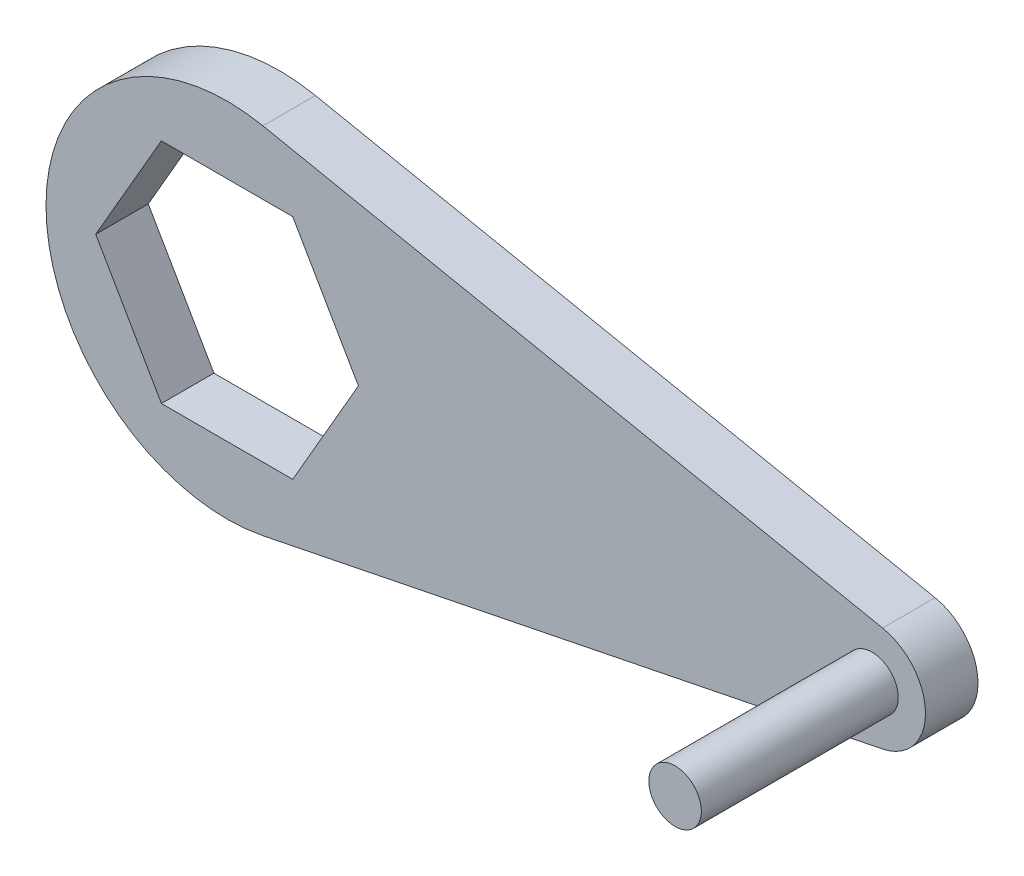
ISO-10303-21;
HEADER;
FILE_DESCRIPTION(('STEP AP214'),'2;1');
FILE_NAME('part.step','',(''),(''),'','','');
FILE_SCHEMA(('AUTOMOTIVE_DESIGN { 1 0 10303 214 1 1 1 1 }'));
ENDSEC;
DATA;
#1=APPLICATION_CONTEXT('core data for automotive mechanical design processes');
#2=APPLICATION_PROTOCOL_DEFINITION('international standard','automotive_design',2000,#1);
#3=PRODUCT_CONTEXT('',#1,'mechanical');
#4=PRODUCT('Part','Part','',(#3));
#5=PRODUCT_RELATED_PRODUCT_CATEGORY('part','',(#4));
#6=PRODUCT_DEFINITION_FORMATION('','',#4);
#7=PRODUCT_DEFINITION_CONTEXT('part definition',#1,'design');
#8=PRODUCT_DEFINITION('design','',#6,#7);
#9=PRODUCT_DEFINITION_SHAPE('','',#8);
#10=(LENGTH_UNIT() NAMED_UNIT(*) SI_UNIT(.MILLI.,.METRE.));
#11=(NAMED_UNIT(*) PLANE_ANGLE_UNIT() SI_UNIT($,.RADIAN.));
#12=(NAMED_UNIT(*) SI_UNIT($,.STERADIAN.) SOLID_ANGLE_UNIT());
#13=UNCERTAINTY_MEASURE_WITH_UNIT(LENGTH_MEASURE(1.E-05),#10,'distance_accuracy_value','');
#14=(GEOMETRIC_REPRESENTATION_CONTEXT(3) GLOBAL_UNCERTAINTY_ASSIGNED_CONTEXT((#13)) GLOBAL_UNIT_ASSIGNED_CONTEXT((#10,
#11,#12)) REPRESENTATION_CONTEXT('',''));
#15=CARTESIAN_POINT('',(0.,0.,0.));
#16=DIRECTION('',(0.,0.,1.));
#17=DIRECTION('',(1.,0.,0.));
#18=AXIS2_PLACEMENT_3D('',#15,#16,#17);
#19=CARTESIAN_POINT('',(0.,0.,5.08));
#20=DIRECTION('',(0.,0.,1.));
#21=DIRECTION('',(1.,0.,0.));
#22=AXIS2_PLACEMENT_3D('',#19,#20,#21);
#23=PLANE('',#22);
#24=CARTESIAN_POINT('',(62.385420387172,0.,5.08));
#25=DIRECTION('',(0.,0.,1.));
#26=DIRECTION('',(1.,0.,0.));
#27=AXIS2_PLACEMENT_3D('',#24,#25,#26);
#28=CIRCLE('',#27,2.53999999999999);
#29=CARTESIAN_POINT('',(59.8454203871721,0.,5.08));
#30=VERTEX_POINT('',#29);
#31=EDGE_CURVE('E399',#30,#30,#28,.T.);
#32=ORIENTED_EDGE('',*,*,#31,.F.);
#33=EDGE_LOOP('',(#32));
#34=FACE_BOUND('',#33,.T.);
#35=CARTESIAN_POINT('',(0.,0.,5.08));
#36=DIRECTION('',(0.,0.,1.));
#37=DIRECTION('',(1.,0.,0.));
#38=AXIS2_PLACEMENT_3D('',#35,#36,#37);
#39=CIRCLE('',#38,17.5139644972821);
#40=CARTESIAN_POINT('',(3.46517655553102,17.1677460329263,5.08));
#41=VERTEX_POINT('',#40);
#42=CARTESIAN_POINT('',(3.46517655553102,-17.1677460329263,5.08));
#43=VERTEX_POINT('',#42);
#44=EDGE_CURVE('E218',#41,#43,#39,.T.);
#45=ORIENTED_EDGE('',*,*,#44,.T.);
#46=DIRECTION('',(0.98023186215722,0.197852208508745,0.));
#47=VECTOR('',#46,1.);
#48=CARTESIAN_POINT('',(3.46517655553102,-17.1677460329263,5.08));
#49=LINE('',#48,#47);
#50=CARTESIAN_POINT('',(63.4084886927891,-5.06865279840813,5.08));
#51=VERTEX_POINT('',#50);
#52=EDGE_CURVE('E222',#43,#51,#49,.T.);
#53=ORIENTED_EDGE('',*,*,#52,.T.);
#54=CARTESIAN_POINT('',(62.385420387172,0.,5.08));
#55=DIRECTION('',(0.,0.,-1.));
#56=DIRECTION('',(-1.,0.,0.));
#57=AXIS2_PLACEMENT_3D('',#54,#55,#56);
#58=CIRCLE('',#57,5.17087129493365);
#59=CARTESIAN_POINT('',(63.4084886927891,5.06865279840813,5.08));
#60=VERTEX_POINT('',#59);
#61=EDGE_CURVE('E226',#60,#51,#58,.T.);
#62=ORIENTED_EDGE('',*,*,#61,.F.);
#63=DIRECTION('',(0.98023186215722,-0.197852208508745,0.));
#64=VECTOR('',#63,1.);
#65=CARTESIAN_POINT('',(3.46517655553102,17.1677460329263,5.08));
#66=LINE('',#65,#64);
#67=EDGE_CURVE('E230',#41,#60,#66,.T.);
#68=ORIENTED_EDGE('',*,*,#67,.F.);
#69=EDGE_LOOP('',(#45,#53,#62,#68));
#70=FACE_BOUND('',#69,.T.);
#71=DIRECTION('',(0.5,0.866025403784439,0.));
#72=VECTOR('',#71,1.);
#73=CARTESIAN_POINT('',(9.52772595777071,-5.5008351464839,5.08));
#74=LINE('',#73,#72);
#75=CARTESIAN_POINT('',(6.35181730518047,-11.0016702929678,5.08));
#76=VERTEX_POINT('',#75);
#77=CARTESIAN_POINT('',(12.7036346103609,0.,5.08));
#78=VERTEX_POINT('',#77);
#79=EDGE_CURVE('E156',#76,#78,#74,.T.);
#80=ORIENTED_EDGE('',*,*,#79,.F.);
#81=DIRECTION('',(1.,0.,0.));
#82=VECTOR('',#81,1.);
#83=CARTESIAN_POINT('',(0.,-11.0016702929678,5.08));
#84=LINE('',#83,#82);
#85=CARTESIAN_POINT('',(-6.35181730518048,-11.0016702929678,5.08));
#86=VERTEX_POINT('',#85);
#87=EDGE_CURVE('E147',#86,#76,#84,.T.);
#88=ORIENTED_EDGE('',*,*,#87,.F.);
#89=DIRECTION('',(0.5,-0.866025403784439,0.));
#90=VECTOR('',#89,1.);
#91=CARTESIAN_POINT('',(-9.52772595777071,-5.50083514648391,5.08));
#92=LINE('',#91,#90);
#93=CARTESIAN_POINT('',(-12.7036346103609,0.,5.08));
#94=VERTEX_POINT('',#93);
#95=EDGE_CURVE('E183',#94,#86,#92,.T.);
#96=ORIENTED_EDGE('',*,*,#95,.F.);
#97=DIRECTION('',(-0.5,-0.866025403784439,0.));
#98=VECTOR('',#97,1.);
#99=CARTESIAN_POINT('',(-9.52772595777071,5.5008351464839,5.08));
#100=LINE('',#99,#98);
#101=CARTESIAN_POINT('',(-6.35181730518047,11.0016702929678,5.08));
#102=VERTEX_POINT('',#101);
#103=EDGE_CURVE('E180',#102,#94,#100,.T.);
#104=ORIENTED_EDGE('',*,*,#103,.F.);
#105=DIRECTION('',(-1.,0.,0.));
#106=VECTOR('',#105,1.);
#107=CARTESIAN_POINT('',(0.,11.0016702929678,5.08));
#108=LINE('',#107,#106);
#109=CARTESIAN_POINT('',(6.35181730518047,11.0016702929678,5.08));
#110=VERTEX_POINT('',#109);
#111=EDGE_CURVE('E174',#110,#102,#108,.T.);
#112=ORIENTED_EDGE('',*,*,#111,.F.);
#113=DIRECTION('',(-0.5,0.866025403784439,0.));
#114=VECTOR('',#113,1.);
#115=CARTESIAN_POINT('',(9.52772595777071,5.5008351464839,5.08));
#116=LINE('',#115,#114);
#117=EDGE_CURVE('E170',#78,#110,#116,.T.);
#118=ORIENTED_EDGE('',*,*,#117,.F.);
#119=EDGE_LOOP('',(#80,#88,#96,#104,#112,#118));
#120=FACE_BOUND('',#119,.T.);
#121=ADVANCED_FACE('F69',(#34,#70,#120),#23,.T.);
#122=CARTESIAN_POINT('',(0.,0.,0.));
#123=DIRECTION('',(0.,0.,1.));
#124=DIRECTION('',(1.,0.,0.));
#125=AXIS2_PLACEMENT_3D('',#122,#123,#124);
#126=PLANE('',#125);
#127=CARTESIAN_POINT('',(0.,0.,0.));
#128=DIRECTION('',(0.,0.,1.));
#129=DIRECTION('',(1.,0.,0.));
#130=AXIS2_PLACEMENT_3D('',#127,#128,#129);
#131=CIRCLE('',#130,17.5139644972821);
#132=CARTESIAN_POINT('',(3.46517655553102,17.1677460329263,0.));
#133=VERTEX_POINT('',#132);
#134=CARTESIAN_POINT('',(3.46517655553102,-17.1677460329263,0.));
#135=VERTEX_POINT('',#134);
#136=EDGE_CURVE('E165',#133,#135,#131,.T.);
#137=ORIENTED_EDGE('',*,*,#136,.F.);
#138=DIRECTION('',(0.98023186215722,-0.197852208508745,0.));
#139=VECTOR('',#138,1.);
#140=CARTESIAN_POINT('',(3.46517655553102,17.1677460329263,0.));
#141=LINE('',#140,#139);
#142=CARTESIAN_POINT('',(63.4084886927891,5.06865279840813,0.));
#143=VERTEX_POINT('',#142);
#144=EDGE_CURVE('E223',#133,#143,#141,.T.);
#145=ORIENTED_EDGE('',*,*,#144,.T.);
#146=CARTESIAN_POINT('',(62.385420387172,0.,0.));
#147=DIRECTION('',(0.,0.,-1.));
#148=DIRECTION('',(-1.,0.,0.));
#149=AXIS2_PLACEMENT_3D('',#146,#147,#148);
#150=CIRCLE('',#149,5.17087129493365);
#151=CARTESIAN_POINT('',(63.4084886927891,-5.06865279840813,0.));
#152=VERTEX_POINT('',#151);
#153=EDGE_CURVE('E242',#143,#152,#150,.T.);
#154=ORIENTED_EDGE('',*,*,#153,.T.);
#155=DIRECTION('',(0.98023186215722,0.197852208508745,0.));
#156=VECTOR('',#155,1.);
#157=CARTESIAN_POINT('',(3.46517655553102,-17.1677460329263,0.));
#158=LINE('',#157,#156);
#159=EDGE_CURVE('E238',#135,#152,#158,.T.);
#160=ORIENTED_EDGE('',*,*,#159,.F.);
#161=EDGE_LOOP('',(#137,#145,#154,#160));
#162=FACE_BOUND('',#161,.T.);
#163=DIRECTION('',(1.,0.,0.));
#164=VECTOR('',#163,1.);
#165=CARTESIAN_POINT('',(0.,-11.0016702929678,0.));
#166=LINE('',#165,#164);
#167=CARTESIAN_POINT('',(-6.35181730518048,-11.0016702929678,0.));
#168=VERTEX_POINT('',#167);
#169=CARTESIAN_POINT('',(6.35181730518047,-11.0016702929678,0.));
#170=VERTEX_POINT('',#169);
#171=EDGE_CURVE('E93',#168,#170,#166,.T.);
#172=ORIENTED_EDGE('',*,*,#171,.T.);
#173=DIRECTION('',(0.5,0.866025403784439,0.));
#174=VECTOR('',#173,1.);
#175=CARTESIAN_POINT('',(9.52772595777071,-5.5008351464839,0.));
#176=LINE('',#175,#174);
#177=CARTESIAN_POINT('',(12.7036346103609,0.,0.));
#178=VERTEX_POINT('',#177);
#179=EDGE_CURVE('E163',#170,#178,#176,.T.);
#180=ORIENTED_EDGE('',*,*,#179,.T.);
#181=DIRECTION('',(-0.5,0.866025403784439,0.));
#182=VECTOR('',#181,1.);
#183=CARTESIAN_POINT('',(9.52772595777071,5.5008351464839,0.));
#184=LINE('',#183,#182);
#185=CARTESIAN_POINT('',(6.35181730518047,11.0016702929678,0.));
#186=VERTEX_POINT('',#185);
#187=EDGE_CURVE('E191',#178,#186,#184,.T.);
#188=ORIENTED_EDGE('',*,*,#187,.T.);
#189=DIRECTION('',(-1.,0.,0.));
#190=VECTOR('',#189,1.);
#191=CARTESIAN_POINT('',(0.,11.0016702929678,0.));
#192=LINE('',#191,#190);
#193=CARTESIAN_POINT('',(-6.35181730518047,11.0016702929678,0.));
#194=VERTEX_POINT('',#193);
#195=EDGE_CURVE('E195',#186,#194,#192,.T.);
#196=ORIENTED_EDGE('',*,*,#195,.T.);
#197=DIRECTION('',(-0.5,-0.866025403784439,0.));
#198=VECTOR('',#197,1.);
#199=CARTESIAN_POINT('',(-9.52772595777071,5.5008351464839,0.));
#200=LINE('',#199,#198);
#201=CARTESIAN_POINT('',(-12.7036346103609,0.,0.));
#202=VERTEX_POINT('',#201);
#203=EDGE_CURVE('E199',#194,#202,#200,.T.);
#204=ORIENTED_EDGE('',*,*,#203,.T.);
#205=DIRECTION('',(0.5,-0.866025403784439,0.));
#206=VECTOR('',#205,1.);
#207=CARTESIAN_POINT('',(-9.52772595777071,-5.50083514648391,0.));
#208=LINE('',#207,#206);
#209=EDGE_CURVE('E157',#202,#168,#208,.T.);
#210=ORIENTED_EDGE('',*,*,#209,.T.);
#211=EDGE_LOOP('',(#172,#180,#188,#196,#204,#210));
#212=FACE_BOUND('',#211,.T.);
#213=ADVANCED_FACE('F264',(#162,#212),#126,.F.);
#214=CARTESIAN_POINT('',(0.,0.,5.08));
#215=DIRECTION('',(0.,0.,-1.));
#216=DIRECTION('',(-1.,0.,0.));
#217=AXIS2_PLACEMENT_3D('',#214,#215,#216);
#218=CYLINDRICAL_SURFACE('',#217,17.5139644972821);
#219=ORIENTED_EDGE('',*,*,#136,.T.);
#220=DIRECTION('',(0.,0.,-1.));
#221=VECTOR('',#220,1.);
#222=CARTESIAN_POINT('',(3.46517655553102,-17.1677460329263,5.08));
#223=LINE('',#222,#221);
#224=EDGE_CURVE('E12',#43,#135,#223,.T.);
#225=ORIENTED_EDGE('',*,*,#224,.F.);
#226=ORIENTED_EDGE('',*,*,#44,.F.);
#227=DIRECTION('',(0.,0.,-1.));
#228=VECTOR('',#227,1.);
#229=CARTESIAN_POINT('',(3.46517655553102,17.1677460329263,5.08));
#230=LINE('',#229,#228);
#231=EDGE_CURVE('E234',#41,#133,#230,.T.);
#232=ORIENTED_EDGE('',*,*,#231,.T.);
#233=EDGE_LOOP('',(#219,#225,#226,#232));
#234=FACE_BOUND('',#233,.T.);
#235=ADVANCED_FACE('F71',(#234),#218,.T.);
#236=CARTESIAN_POINT('',(3.46517655553102,-17.1677460329263,5.08));
#237=DIRECTION('',(-0.197852208508745,0.980231862157221,0.));
#238=DIRECTION('',(-0.980231862157221,-0.197852208508745,0.));
#239=AXIS2_PLACEMENT_3D('',#236,#237,#238);
#240=PLANE('',#239);
#241=ORIENTED_EDGE('',*,*,#159,.T.);
#242=DIRECTION('',(0.,0.,-1.));
#243=VECTOR('',#242,1.);
#244=CARTESIAN_POINT('',(63.4084886927891,-5.06865279840813,5.08));
#245=LINE('',#244,#243);
#246=EDGE_CURVE('E78',#51,#152,#245,.T.);
#247=ORIENTED_EDGE('',*,*,#246,.F.);
#248=ORIENTED_EDGE('',*,*,#52,.F.);
#249=ORIENTED_EDGE('',*,*,#224,.T.);
#250=EDGE_LOOP('',(#241,#247,#248,#249));
#251=FACE_BOUND('',#250,.T.);
#252=ADVANCED_FACE('F260',(#251),#240,.F.);
#253=CARTESIAN_POINT('',(62.385420387172,0.,5.08));
#254=DIRECTION('',(0.,0.,-1.));
#255=DIRECTION('',(-1.,0.,0.));
#256=AXIS2_PLACEMENT_3D('',#253,#254,#255);
#257=CYLINDRICAL_SURFACE('',#256,5.17087129493365);
#258=ORIENTED_EDGE('',*,*,#153,.F.);
#259=DIRECTION('',(0.,0.,-1.));
#260=VECTOR('',#259,1.);
#261=CARTESIAN_POINT('',(63.4084886927891,5.06865279840813,5.08));
#262=LINE('',#261,#260);
#263=EDGE_CURVE('E251',#60,#143,#262,.T.);
#264=ORIENTED_EDGE('',*,*,#263,.F.);
#265=ORIENTED_EDGE('',*,*,#61,.T.);
#266=ORIENTED_EDGE('',*,*,#246,.T.);
#267=EDGE_LOOP('',(#258,#264,#265,#266));
#268=FACE_BOUND('',#267,.T.);
#269=ADVANCED_FACE('F257',(#268),#257,.T.);
#270=CARTESIAN_POINT('',(3.46517655553102,17.1677460329263,5.08));
#271=DIRECTION('',(0.197852208508745,0.980231862157221,0.));
#272=DIRECTION('',(-0.980231862157221,0.197852208508745,0.));
#273=AXIS2_PLACEMENT_3D('',#270,#271,#272);
#274=PLANE('',#273);
#275=ORIENTED_EDGE('',*,*,#144,.F.);
#276=ORIENTED_EDGE('',*,*,#231,.F.);
#277=ORIENTED_EDGE('',*,*,#67,.T.);
#278=ORIENTED_EDGE('',*,*,#263,.T.);
#279=EDGE_LOOP('',(#275,#276,#277,#278));
#280=FACE_BOUND('',#279,.T.);
#281=ADVANCED_FACE('F268',(#280),#274,.T.);
#282=CARTESIAN_POINT('',(0.,-11.0016702929678,5.08));
#283=DIRECTION('',(0.,1.,0.));
#284=DIRECTION('',(-1.,0.,0.));
#285=AXIS2_PLACEMENT_3D('',#282,#283,#284);
#286=PLANE('',#285);
#287=ORIENTED_EDGE('',*,*,#171,.F.);
#288=DIRECTION('',(0.,0.,-1.));
#289=VECTOR('',#288,1.);
#290=CARTESIAN_POINT('',(-6.35181730518048,-11.0016702929678,5.08));
#291=LINE('',#290,#289);
#292=EDGE_CURVE('E151',#86,#168,#291,.T.);
#293=ORIENTED_EDGE('',*,*,#292,.F.);
#294=ORIENTED_EDGE('',*,*,#87,.T.);
#295=DIRECTION('',(0.,0.,-1.));
#296=VECTOR('',#295,1.);
#297=CARTESIAN_POINT('',(6.35181730518047,-11.0016702929678,5.08));
#298=LINE('',#297,#296);
#299=EDGE_CURVE('E150',#76,#170,#298,.T.);
#300=ORIENTED_EDGE('',*,*,#299,.T.);
#301=EDGE_LOOP('',(#287,#293,#294,#300));
#302=FACE_BOUND('',#301,.T.);
#303=ADVANCED_FACE('F149',(#302),#286,.T.);
#304=CARTESIAN_POINT('',(9.52772595777071,-5.5008351464839,5.08));
#305=DIRECTION('',(-0.866025403784439,0.5,0.));
#306=DIRECTION('',(-0.5,-0.866025403784439,0.));
#307=AXIS2_PLACEMENT_3D('',#304,#305,#306);
#308=PLANE('',#307);
#309=ORIENTED_EDGE('',*,*,#179,.F.);
#310=ORIENTED_EDGE('',*,*,#299,.F.);
#311=ORIENTED_EDGE('',*,*,#79,.T.);
#312=DIRECTION('',(0.,0.,-1.));
#313=VECTOR('',#312,1.);
#314=CARTESIAN_POINT('',(12.7036346103609,0.,5.08));
#315=LINE('',#314,#313);
#316=EDGE_CURVE('E166',#78,#178,#315,.T.);
#317=ORIENTED_EDGE('',*,*,#316,.T.);
#318=EDGE_LOOP('',(#309,#310,#311,#317));
#319=FACE_BOUND('',#318,.T.);
#320=ADVANCED_FACE('F160',(#319),#308,.T.);
#321=CARTESIAN_POINT('',(9.52772595777071,5.5008351464839,5.08));
#322=DIRECTION('',(-0.866025403784439,-0.5,0.));
#323=DIRECTION('',(0.5,-0.866025403784439,0.));
#324=AXIS2_PLACEMENT_3D('',#321,#322,#323);
#325=PLANE('',#324);
#326=ORIENTED_EDGE('',*,*,#187,.F.);
#327=ORIENTED_EDGE('',*,*,#316,.F.);
#328=ORIENTED_EDGE('',*,*,#117,.T.);
#329=DIRECTION('',(0.,0.,-1.));
#330=VECTOR('',#329,1.);
#331=CARTESIAN_POINT('',(6.35181730518047,11.0016702929678,5.08));
#332=LINE('',#331,#330);
#333=EDGE_CURVE('E213',#110,#186,#332,.T.);
#334=ORIENTED_EDGE('',*,*,#333,.T.);
#335=EDGE_LOOP('',(#326,#327,#328,#334));
#336=FACE_BOUND('',#335,.T.);
#337=ADVANCED_FACE('F310',(#336),#325,.T.);
#338=CARTESIAN_POINT('',(0.,11.0016702929678,5.08));
#339=DIRECTION('',(0.,-1.,0.));
#340=DIRECTION('',(0.,0.,-1.));
#341=AXIS2_PLACEMENT_3D('',#338,#339,#340);
#342=PLANE('',#341);
#343=ORIENTED_EDGE('',*,*,#195,.F.);
#344=ORIENTED_EDGE('',*,*,#333,.F.);
#345=ORIENTED_EDGE('',*,*,#111,.T.);
#346=DIRECTION('',(0.,0.,-1.));
#347=VECTOR('',#346,1.);
#348=CARTESIAN_POINT('',(-6.35181730518047,11.0016702929678,5.08));
#349=LINE('',#348,#347);
#350=EDGE_CURVE('E210',#102,#194,#349,.T.);
#351=ORIENTED_EDGE('',*,*,#350,.T.);
#352=EDGE_LOOP('',(#343,#344,#345,#351));
#353=FACE_BOUND('',#352,.T.);
#354=ADVANCED_FACE('F316',(#353),#342,.T.);
#355=CARTESIAN_POINT('',(-9.52772595777071,5.5008351464839,5.08));
#356=DIRECTION('',(0.866025403784439,-0.5,0.));
#357=DIRECTION('',(0.5,0.866025403784439,0.));
#358=AXIS2_PLACEMENT_3D('',#355,#356,#357);
#359=PLANE('',#358);
#360=ORIENTED_EDGE('',*,*,#203,.F.);
#361=ORIENTED_EDGE('',*,*,#350,.F.);
#362=ORIENTED_EDGE('',*,*,#103,.T.);
#363=DIRECTION('',(0.,0.,-1.));
#364=VECTOR('',#363,1.);
#365=CARTESIAN_POINT('',(-12.7036346103609,0.,5.08));
#366=LINE('',#365,#364);
#367=EDGE_CURVE('E85',#94,#202,#366,.T.);
#368=ORIENTED_EDGE('',*,*,#367,.T.);
#369=EDGE_LOOP('',(#360,#361,#362,#368));
#370=FACE_BOUND('',#369,.T.);
#371=ADVANCED_FACE('F324',(#370),#359,.T.);
#372=CARTESIAN_POINT('',(-9.52772595777071,-5.50083514648391,5.08));
#373=DIRECTION('',(0.866025403784439,0.5,0.));
#374=DIRECTION('',(-0.5,0.866025403784439,0.));
#375=AXIS2_PLACEMENT_3D('',#372,#373,#374);
#376=PLANE('',#375);
#377=ORIENTED_EDGE('',*,*,#209,.F.);
#378=ORIENTED_EDGE('',*,*,#367,.F.);
#379=ORIENTED_EDGE('',*,*,#95,.T.);
#380=ORIENTED_EDGE('',*,*,#292,.T.);
#381=EDGE_LOOP('',(#377,#378,#379,#380));
#382=FACE_BOUND('',#381,.T.);
#383=ADVANCED_FACE('F332',(#382),#376,.T.);
#384=CARTESIAN_POINT('',(62.385420387172,0.,24.13));
#385=DIRECTION('',(0.,0.,-1.));
#386=DIRECTION('',(-1.,0.,0.));
#387=AXIS2_PLACEMENT_3D('',#384,#385,#386);
#388=CYLINDRICAL_SURFACE('',#387,2.53999999999999);
#389=CARTESIAN_POINT('',(62.385420387172,0.,24.13));
#390=DIRECTION('',(0.,0.,1.));
#391=DIRECTION('',(1.,0.,0.));
#392=AXIS2_PLACEMENT_3D('',#389,#390,#391);
#393=CIRCLE('',#392,2.53999999999999);
#394=CARTESIAN_POINT('',(59.8454203871721,0.,24.13));
#395=VERTEX_POINT('',#394);
#396=EDGE_CURVE('E188',#395,#395,#393,.T.);
#397=CARTESIAN_POINT('',(59.8454203871721,0.,24.13));
#398=CARTESIAN_POINT('',(59.8454203871721,0.,23.9315625));
#399=CARTESIAN_POINT('',(59.8454203871721,0.,23.733125));
#400=CARTESIAN_POINT('',(59.8454203871721,0.,23.33625));
#401=CARTESIAN_POINT('',(59.8454203871721,0.,23.1378125));
#402=CARTESIAN_POINT('',(59.8454203871721,0.,22.7409375));
#403=CARTESIAN_POINT('',(59.8454203871721,0.,22.5425));
#404=CARTESIAN_POINT('',(59.8454203871721,0.,22.145625));
#405=CARTESIAN_POINT('',(59.8454203871721,0.,21.9471875));
#406=CARTESIAN_POINT('',(59.8454203871721,0.,21.5503125));
#407=CARTESIAN_POINT('',(59.8454203871721,0.,21.351875));
#408=CARTESIAN_POINT('',(59.8454203871721,0.,20.955));
#409=CARTESIAN_POINT('',(59.8454203871721,0.,20.7565625));
#410=CARTESIAN_POINT('',(59.8454203871721,0.,20.3596875));
#411=CARTESIAN_POINT('',(59.8454203871721,0.,20.16125));
#412=CARTESIAN_POINT('',(59.8454203871721,0.,19.764375));
#413=CARTESIAN_POINT('',(59.8454203871721,0.,19.5659375));
#414=CARTESIAN_POINT('',(59.8454203871721,0.,19.1690625));
#415=CARTESIAN_POINT('',(59.8454203871721,0.,18.970625));
#416=CARTESIAN_POINT('',(59.8454203871721,0.,18.57375));
#417=CARTESIAN_POINT('',(59.8454203871721,0.,18.3753125));
#418=CARTESIAN_POINT('',(59.8454203871721,0.,17.9784375));
#419=CARTESIAN_POINT('',(59.8454203871721,0.,17.78));
#420=CARTESIAN_POINT('',(59.8454203871721,0.,17.383125));
#421=CARTESIAN_POINT('',(59.8454203871721,0.,17.1846875));
#422=CARTESIAN_POINT('',(59.8454203871721,0.,16.7878125));
#423=CARTESIAN_POINT('',(59.8454203871721,0.,16.589375));
#424=CARTESIAN_POINT('',(59.8454203871721,0.,16.1925));
#425=CARTESIAN_POINT('',(59.8454203871721,0.,15.9940625));
#426=CARTESIAN_POINT('',(59.8454203871721,0.,15.5971875));
#427=CARTESIAN_POINT('',(59.8454203871721,0.,15.39875));
#428=CARTESIAN_POINT('',(59.8454203871721,0.,15.001875));
#429=CARTESIAN_POINT('',(59.8454203871721,0.,14.8034375));
#430=CARTESIAN_POINT('',(59.8454203871721,0.,14.4065625));
#431=CARTESIAN_POINT('',(59.8454203871721,0.,14.208125));
#432=CARTESIAN_POINT('',(59.8454203871721,0.,13.81125));
#433=CARTESIAN_POINT('',(59.8454203871721,0.,13.6128125));
#434=CARTESIAN_POINT('',(59.8454203871721,0.,13.2159375));
#435=CARTESIAN_POINT('',(59.8454203871721,0.,13.0175));
#436=CARTESIAN_POINT('',(59.8454203871721,0.,12.620625));
#437=CARTESIAN_POINT('',(59.8454203871721,0.,12.4221875));
#438=CARTESIAN_POINT('',(59.8454203871721,0.,12.0253125));
#439=CARTESIAN_POINT('',(59.8454203871721,0.,11.826875));
#440=CARTESIAN_POINT('',(59.8454203871721,0.,11.43));
#441=CARTESIAN_POINT('',(59.8454203871721,0.,11.2315625));
#442=CARTESIAN_POINT('',(59.8454203871721,0.,10.8346875));
#443=CARTESIAN_POINT('',(59.8454203871721,0.,10.63625));
#444=CARTESIAN_POINT('',(59.8454203871721,0.,10.239375));
#445=CARTESIAN_POINT('',(59.8454203871721,0.,10.0409375));
#446=CARTESIAN_POINT('',(59.8454203871721,0.,9.6440625));
#447=CARTESIAN_POINT('',(59.8454203871721,0.,9.445625));
#448=CARTESIAN_POINT('',(59.8454203871721,0.,9.04875));
#449=CARTESIAN_POINT('',(59.8454203871721,0.,8.8503125));
#450=CARTESIAN_POINT('',(59.8454203871721,0.,8.4534375));
#451=CARTESIAN_POINT('',(59.8454203871721,0.,8.255));
#452=CARTESIAN_POINT('',(59.8454203871721,0.,7.858125));
#453=CARTESIAN_POINT('',(59.8454203871721,0.,7.6596875));
#454=CARTESIAN_POINT('',(59.8454203871721,0.,7.2628125));
#455=CARTESIAN_POINT('',(59.8454203871721,0.,7.064375));
#456=CARTESIAN_POINT('',(59.8454203871721,0.,6.6675));
#457=CARTESIAN_POINT('',(59.8454203871721,0.,6.4690625));
#458=CARTESIAN_POINT('',(59.8454203871721,0.,6.0721875));
#459=CARTESIAN_POINT('',(59.8454203871721,0.,5.87375));
#460=CARTESIAN_POINT('',(59.8454203871721,0.,5.476875));
#461=CARTESIAN_POINT('',(59.8454203871721,0.,5.2784375));
#462=CARTESIAN_POINT('',(59.8454203871721,0.,5.08));
#463=B_SPLINE_CURVE_WITH_KNOTS('',3,(#397,#398,#399,#400,#401,#402,#403,#404,#405,#406,#407,
#408,#409,#410,#411,#412,#413,#414,#415,#416,#417,#418,#419,#420,#421,#422,#423,#424,#425,#426,
#427,#428,#429,#430,#431,#432,#433,#434,#435,#436,#437,#438,#439,#440,#441,#442,#443,#444,#445,
#446,#447,#448,#449,#450,#451,#452,#453,#454,#455,#456,#457,#458,#459,#460,#461,#462),
.UNSPECIFIED.,.F.,.F.,(4,2,2,2,2,2,2,2,2,2,2,2,2,2,2,2,2,2,2,2,2,2,2,2,2,2,2,2,2,2,2,2,4),(0.,
0.595312499999997,1.190625,1.7859375,2.38125,2.9765625,3.571875,4.1671875,4.7625,5.3578125,
5.953125,6.5484375,7.14375,7.7390625,8.334375,8.9296875,9.525,10.1203125,10.715625,11.3109375,
11.90625,12.5015625,13.096875,13.6921875,14.2875,14.8828125,15.478125,16.0734375,16.66875,
17.2640625,17.859375,18.4546875,19.05),.UNSPECIFIED.);
#464=EDGE_CURVE('BSEAM340',#395,#30,#463,.T.);
#465=ORIENTED_EDGE('',*,*,#396,.F.);
#466=ORIENTED_EDGE('',*,*,#31,.T.);
#467=ORIENTED_EDGE('',*,*,#464,.T.);
#468=ORIENTED_EDGE('',*,*,#464,.F.);
#469=EDGE_LOOP('',(#465,#467,#466,#468));
#470=FACE_BOUND('',#469,.T.);
#471=ADVANCED_FACE('F340',(#470),#388,.T.);
#472=CARTESIAN_POINT('',(62.385420387172,0.,24.13));
#473=DIRECTION('',(0.,0.,1.));
#474=DIRECTION('',(1.,0.,0.));
#475=AXIS2_PLACEMENT_3D('',#472,#473,#474);
#476=PLANE('',#475);
#477=ORIENTED_EDGE('',*,*,#396,.T.);
#478=EDGE_LOOP('',(#477));
#479=FACE_BOUND('',#478,.T.);
#480=ADVANCED_FACE('F347',(#479),#476,.T.);
#481=CLOSED_SHELL('',(#121,#213,#235,#252,#269,#281,#303,#320,#337,#354,#371,#383,#471,#480));
#482=MANIFOLD_SOLID_BREP('B2',#481);
#483=ADVANCED_BREP_SHAPE_REPRESENTATION('',(#18,#482),#14);
#484=SHAPE_DEFINITION_REPRESENTATION(#9,#483);
ENDSEC;
END-ISO-10303-21;
